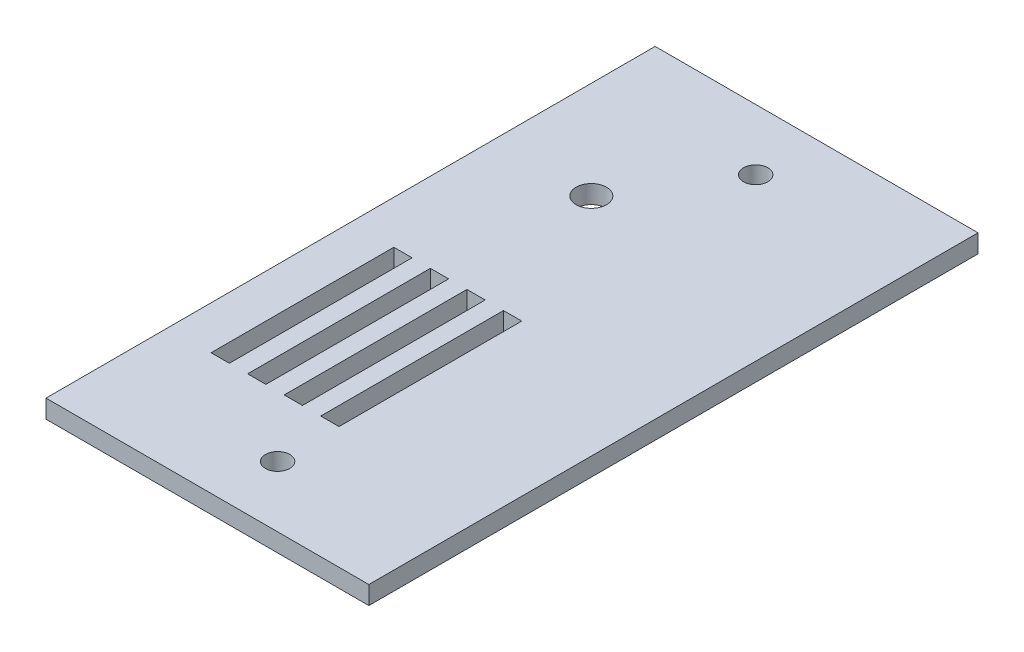
ISO-10303-21;
HEADER;
FILE_DESCRIPTION(('STEP AP214'),'2;1');
FILE_NAME('part.step','',(''),(''),'','','');
FILE_SCHEMA(('AUTOMOTIVE_DESIGN { 1 0 10303 214 1 1 1 1 }'));
ENDSEC;
DATA;
#1=APPLICATION_CONTEXT('core data for automotive mechanical design processes');
#2=APPLICATION_PROTOCOL_DEFINITION('international standard','automotive_design',2000,#1);
#3=PRODUCT_CONTEXT('',#1,'mechanical');
#4=PRODUCT('Part','Part','',(#3));
#5=PRODUCT_RELATED_PRODUCT_CATEGORY('part','',(#4));
#6=PRODUCT_DEFINITION_FORMATION('','',#4);
#7=PRODUCT_DEFINITION_CONTEXT('part definition',#1,'design');
#8=PRODUCT_DEFINITION('design','',#6,#7);
#9=PRODUCT_DEFINITION_SHAPE('','',#8);
#10=(LENGTH_UNIT() NAMED_UNIT(*) SI_UNIT(.MILLI.,.METRE.));
#11=(NAMED_UNIT(*) PLANE_ANGLE_UNIT() SI_UNIT($,.RADIAN.));
#12=(NAMED_UNIT(*) SI_UNIT($,.STERADIAN.) SOLID_ANGLE_UNIT());
#13=UNCERTAINTY_MEASURE_WITH_UNIT(LENGTH_MEASURE(1.E-05),#10,'distance_accuracy_value','');
#14=(GEOMETRIC_REPRESENTATION_CONTEXT(3) GLOBAL_UNCERTAINTY_ASSIGNED_CONTEXT((#13)) GLOBAL_UNIT_ASSIGNED_CONTEXT((#10,
#11,#12)) REPRESENTATION_CONTEXT('',''));
#15=CARTESIAN_POINT('',(0.,0.,0.));
#16=DIRECTION('',(0.,0.,1.));
#17=DIRECTION('',(1.,0.,0.));
#18=AXIS2_PLACEMENT_3D('',#15,#16,#17);
#19=CARTESIAN_POINT('',(-53.020406011683,3.,-100.000000000001));
#20=DIRECTION('',(1.,0.,0.));
#21=DIRECTION('',(0.,0.,-1.));
#22=AXIS2_PLACEMENT_3D('',#19,#20,#21);
#23=PLANE('',#22);
#24=DIRECTION('',(0.,0.,1.));
#25=VECTOR('',#24,1.);
#26=CARTESIAN_POINT('',(-53.020406011683,0.,-100.000000000001));
#27=LINE('',#26,#25);
#28=CARTESIAN_POINT('',(-53.020406011683,0.,-100.000000000001));
#29=VERTEX_POINT('',#28);
#30=CARTESIAN_POINT('',(-53.020406011683,0.,-8.88178419700125E-13));
#31=VERTEX_POINT('',#30);
#32=EDGE_CURVE('E330',#29,#31,#27,.T.);
#33=ORIENTED_EDGE('',*,*,#32,.T.);
#34=DIRECTION('',(0.,-1.,0.));
#35=VECTOR('',#34,1.);
#36=CARTESIAN_POINT('',(-53.020406011683,3.,-8.88178419700125E-13));
#37=LINE('',#36,#35);
#38=CARTESIAN_POINT('',(-53.020406011683,3.,-8.88178419700125E-13));
#39=VERTEX_POINT('',#38);
#40=EDGE_CURVE('E353',#39,#31,#37,.T.);
#41=ORIENTED_EDGE('',*,*,#40,.F.);
#42=DIRECTION('',(0.,0.,1.));
#43=VECTOR('',#42,1.);
#44=CARTESIAN_POINT('',(-53.020406011683,3.,-100.000000000001));
#45=LINE('',#44,#43);
#46=CARTESIAN_POINT('',(-53.020406011683,3.,-100.000000000001));
#47=VERTEX_POINT('',#46);
#48=EDGE_CURVE('E313',#47,#39,#45,.T.);
#49=ORIENTED_EDGE('',*,*,#48,.F.);
#50=DIRECTION('',(0.,-1.,0.));
#51=VECTOR('',#50,1.);
#52=CARTESIAN_POINT('',(-53.020406011683,3.,-100.000000000001));
#53=LINE('',#52,#51);
#54=EDGE_CURVE('E329',#47,#29,#53,.T.);
#55=ORIENTED_EDGE('',*,*,#54,.T.);
#56=EDGE_LOOP('',(#33,#41,#49,#55));
#57=FACE_BOUND('',#56,.T.);
#58=ADVANCED_FACE('F39',(#57),#23,.F.);
#59=CARTESIAN_POINT('',(-53.020406011683,3.,-8.88178419700125E-13));
#60=DIRECTION('',(0.,0.,-1.));
#61=DIRECTION('',(-1.,0.,0.));
#62=AXIS2_PLACEMENT_3D('',#59,#60,#61);
#63=PLANE('',#62);
#64=DIRECTION('',(1.,0.,0.));
#65=VECTOR('',#64,1.);
#66=CARTESIAN_POINT('',(-53.020406011683,0.,-8.88178419700125E-13));
#67=LINE('',#66,#65);
#68=CARTESIAN_POINT('',(-0.0204060116829677,0.,-8.88178419700125E-13));
#69=VERTEX_POINT('',#68);
#70=EDGE_CURVE('E334',#31,#69,#67,.T.);
#71=ORIENTED_EDGE('',*,*,#70,.T.);
#72=DIRECTION('',(0.,-1.,0.));
#73=VECTOR('',#72,1.);
#74=CARTESIAN_POINT('',(-0.0204060116829677,3.,-8.88178419700125E-13));
#75=LINE('',#74,#73);
#76=CARTESIAN_POINT('',(-0.0204060116829677,3.,-8.88178419700125E-13));
#77=VERTEX_POINT('',#76);
#78=EDGE_CURVE('E350',#77,#69,#75,.T.);
#79=ORIENTED_EDGE('',*,*,#78,.F.);
#80=DIRECTION('',(1.,0.,0.));
#81=VECTOR('',#80,1.);
#82=CARTESIAN_POINT('',(-53.020406011683,3.,-8.88178419700125E-13));
#83=LINE('',#82,#81);
#84=EDGE_CURVE('E317',#39,#77,#83,.T.);
#85=ORIENTED_EDGE('',*,*,#84,.F.);
#86=ORIENTED_EDGE('',*,*,#40,.T.);
#87=EDGE_LOOP('',(#71,#79,#85,#86));
#88=FACE_BOUND('',#87,.T.);
#89=ADVANCED_FACE('F441',(#88),#63,.F.);
#90=CARTESIAN_POINT('',(-0.0204060116829816,3.,-100.000000000001));
#91=DIRECTION('',(1.,0.,0.));
#92=DIRECTION('',(0.,0.,-1.));
#93=AXIS2_PLACEMENT_3D('',#90,#91,#92);
#94=PLANE('',#93);
#95=DIRECTION('',(0.,0.,1.));
#96=VECTOR('',#95,1.);
#97=CARTESIAN_POINT('',(-0.0204060116829816,0.,-100.000000000001));
#98=LINE('',#97,#96);
#99=CARTESIAN_POINT('',(-0.0204060116829816,0.,-100.000000000001));
#100=VERTEX_POINT('',#99);
#101=EDGE_CURVE('E338',#100,#69,#98,.T.);
#102=ORIENTED_EDGE('',*,*,#101,.F.);
#103=DIRECTION('',(0.,-1.,0.));
#104=VECTOR('',#103,1.);
#105=CARTESIAN_POINT('',(-0.0204060116829816,3.,-100.000000000001));
#106=LINE('',#105,#104);
#107=CARTESIAN_POINT('',(-0.0204060116829816,3.,-100.000000000001));
#108=VERTEX_POINT('',#107);
#109=EDGE_CURVE('E347',#108,#100,#106,.T.);
#110=ORIENTED_EDGE('',*,*,#109,.F.);
#111=DIRECTION('',(0.,0.,1.));
#112=VECTOR('',#111,1.);
#113=CARTESIAN_POINT('',(-0.0204060116829816,3.,-100.000000000001));
#114=LINE('',#113,#112);
#115=EDGE_CURVE('E321',#108,#77,#114,.T.);
#116=ORIENTED_EDGE('',*,*,#115,.T.);
#117=ORIENTED_EDGE('',*,*,#78,.T.);
#118=EDGE_LOOP('',(#102,#110,#116,#117));
#119=FACE_BOUND('',#118,.T.);
#120=ADVANCED_FACE('F446',(#119),#94,.T.);
#121=CARTESIAN_POINT('',(-53.020406011683,3.,-100.000000000001));
#122=DIRECTION('',(0.,0.,-1.));
#123=DIRECTION('',(-1.,0.,0.));
#124=AXIS2_PLACEMENT_3D('',#121,#122,#123);
#125=PLANE('',#124);
#126=DIRECTION('',(1.,0.,0.));
#127=VECTOR('',#126,1.);
#128=CARTESIAN_POINT('',(-53.020406011683,0.,-100.000000000001));
#129=LINE('',#128,#127);
#130=EDGE_CURVE('E318',#29,#100,#129,.T.);
#131=ORIENTED_EDGE('',*,*,#130,.F.);
#132=ORIENTED_EDGE('',*,*,#54,.F.);
#133=DIRECTION('',(1.,0.,0.));
#134=VECTOR('',#133,1.);
#135=CARTESIAN_POINT('',(-53.020406011683,3.,-100.000000000001));
#136=LINE('',#135,#134);
#137=EDGE_CURVE('E325',#47,#108,#136,.T.);
#138=ORIENTED_EDGE('',*,*,#137,.T.);
#139=ORIENTED_EDGE('',*,*,#109,.T.);
#140=EDGE_LOOP('',(#131,#132,#138,#139));
#141=FACE_BOUND('',#140,.T.);
#142=ADVANCED_FACE('F454',(#141),#125,.T.);
#143=CARTESIAN_POINT('',(0.,3.,0.));
#144=DIRECTION('',(0.,1.,0.));
#145=DIRECTION('',(0.,0.,1.));
#146=AXIS2_PLACEMENT_3D('',#143,#144,#145);
#147=PLANE('',#146);
#148=DIRECTION('',(0.,0.,1.));
#149=VECTOR('',#148,1.);
#150=CARTESIAN_POINT('',(-45.9194619358074,3.,-20.0000000000009));
#151=LINE('',#150,#149);
#152=CARTESIAN_POINT('',(-45.9194619358074,3.,-50.0000000000009));
#153=VERTEX_POINT('',#152);
#154=CARTESIAN_POINT('',(-45.9194619358074,3.,-20.0000000000009));
#155=VERTEX_POINT('',#154);
#156=EDGE_CURVE('E54',#153,#155,#151,.T.);
#157=ORIENTED_EDGE('',*,*,#156,.F.);
#158=DIRECTION('',(-1.,0.,0.));
#159=VECTOR('',#158,1.);
#160=CARTESIAN_POINT('',(-45.9194619358074,3.,-50.0000000000009));
#161=LINE('',#160,#159);
#162=CARTESIAN_POINT('',(-42.9194619358074,3.,-50.0000000000009));
#163=VERTEX_POINT('',#162);
#164=EDGE_CURVE('E202',#163,#153,#161,.T.);
#165=ORIENTED_EDGE('',*,*,#164,.F.);
#166=DIRECTION('',(0.,0.,-1.));
#167=VECTOR('',#166,1.);
#168=CARTESIAN_POINT('',(-42.9194619358074,3.,-20.0000000000009));
#169=LINE('',#168,#167);
#170=CARTESIAN_POINT('',(-42.9194619358074,3.,-20.0000000000009));
#171=VERTEX_POINT('',#170);
#172=EDGE_CURVE('E183',#171,#163,#169,.T.);
#173=ORIENTED_EDGE('',*,*,#172,.F.);
#174=DIRECTION('',(1.,0.,0.));
#175=VECTOR('',#174,1.);
#176=CARTESIAN_POINT('',(-45.9194619358074,3.,-20.0000000000009));
#177=LINE('',#176,#175);
#178=EDGE_CURVE('E194',#155,#171,#177,.T.);
#179=ORIENTED_EDGE('',*,*,#178,.F.);
#180=EDGE_LOOP('',(#157,#165,#173,#179));
#181=FACE_BOUND('',#180,.T.);
#182=DIRECTION('',(0.,0.,-1.));
#183=VECTOR('',#182,1.);
#184=CARTESIAN_POINT('',(-36.9194619358074,3.,-20.0000000000009));
#185=LINE('',#184,#183);
#186=CARTESIAN_POINT('',(-36.9194619358074,3.,-20.0000000000009));
#187=VERTEX_POINT('',#186);
#188=CARTESIAN_POINT('',(-36.9194619358074,3.,-50.0000000000009));
#189=VERTEX_POINT('',#188);
#190=EDGE_CURVE('E62',#187,#189,#185,.T.);
#191=ORIENTED_EDGE('',*,*,#190,.F.);
#192=DIRECTION('',(1.,0.,0.));
#193=VECTOR('',#192,1.);
#194=CARTESIAN_POINT('',(-39.9194619358074,3.,-20.0000000000009));
#195=LINE('',#194,#193);
#196=CARTESIAN_POINT('',(-39.9194619358074,3.,-20.0000000000009));
#197=VERTEX_POINT('',#196);
#198=EDGE_CURVE('E228',#197,#187,#195,.T.);
#199=ORIENTED_EDGE('',*,*,#198,.F.);
#200=DIRECTION('',(0.,0.,1.));
#201=VECTOR('',#200,1.);
#202=CARTESIAN_POINT('',(-39.9194619358074,3.,-20.0000000000009));
#203=LINE('',#202,#201);
#204=CARTESIAN_POINT('',(-39.9194619358074,3.,-50.0000000000009));
#205=VERTEX_POINT('',#204);
#206=EDGE_CURVE('E224',#205,#197,#203,.T.);
#207=ORIENTED_EDGE('',*,*,#206,.F.);
#208=DIRECTION('',(-1.,0.,0.));
#209=VECTOR('',#208,1.);
#210=CARTESIAN_POINT('',(-39.9194619358074,3.,-50.0000000000009));
#211=LINE('',#210,#209);
#212=EDGE_CURVE('E219',#189,#205,#211,.T.);
#213=ORIENTED_EDGE('',*,*,#212,.F.);
#214=EDGE_LOOP('',(#191,#199,#207,#213));
#215=FACE_BOUND('',#214,.T.);
#216=DIRECTION('',(0.,0.,-1.));
#217=VECTOR('',#216,1.);
#218=CARTESIAN_POINT('',(-30.9194619358074,3.,-50.0000000000009));
#219=LINE('',#218,#217);
#220=CARTESIAN_POINT('',(-30.9194619358074,3.,-20.0000000000009));
#221=VERTEX_POINT('',#220);
#222=CARTESIAN_POINT('',(-30.9194619358074,3.,-50.0000000000009));
#223=VERTEX_POINT('',#222);
#224=EDGE_CURVE('E244',#221,#223,#219,.T.);
#225=ORIENTED_EDGE('',*,*,#224,.F.);
#226=DIRECTION('',(1.,0.,0.));
#227=VECTOR('',#226,1.);
#228=CARTESIAN_POINT('',(-33.9194619358074,3.,-20.0000000000009));
#229=LINE('',#228,#227);
#230=CARTESIAN_POINT('',(-33.9194619358074,3.,-20.0000000000009));
#231=VERTEX_POINT('',#230);
#232=EDGE_CURVE('E256',#231,#221,#229,.T.);
#233=ORIENTED_EDGE('',*,*,#232,.F.);
#234=DIRECTION('',(0.,0.,1.));
#235=VECTOR('',#234,1.);
#236=CARTESIAN_POINT('',(-33.9194619358074,3.,-50.0000000000009));
#237=LINE('',#236,#235);
#238=CARTESIAN_POINT('',(-33.9194619358074,3.,-50.0000000000009));
#239=VERTEX_POINT('',#238);
#240=EDGE_CURVE('E252',#239,#231,#237,.T.);
#241=ORIENTED_EDGE('',*,*,#240,.F.);
#242=DIRECTION('',(-1.,0.,0.));
#243=VECTOR('',#242,1.);
#244=CARTESIAN_POINT('',(-33.9194619358074,3.,-50.0000000000009));
#245=LINE('',#244,#243);
#246=EDGE_CURVE('E247',#223,#239,#245,.T.);
#247=ORIENTED_EDGE('',*,*,#246,.F.);
#248=EDGE_LOOP('',(#225,#233,#241,#247));
#249=FACE_BOUND('',#248,.T.);
#250=DIRECTION('',(0.,0.,-1.));
#251=VECTOR('',#250,1.);
#252=CARTESIAN_POINT('',(-24.9194619358074,3.,-20.0000000000009));
#253=LINE('',#252,#251);
#254=CARTESIAN_POINT('',(-24.9194619358074,3.,-20.0000000000009));
#255=VERTEX_POINT('',#254);
#256=CARTESIAN_POINT('',(-24.9194619358074,3.,-50.0000000000009));
#257=VERTEX_POINT('',#256);
#258=EDGE_CURVE('E272',#255,#257,#253,.T.);
#259=ORIENTED_EDGE('',*,*,#258,.F.);
#260=DIRECTION('',(1.,0.,0.));
#261=VECTOR('',#260,1.);
#262=CARTESIAN_POINT('',(-27.9194619358074,3.,-20.0000000000009));
#263=LINE('',#262,#261);
#264=CARTESIAN_POINT('',(-27.9194619358074,3.,-20.0000000000009));
#265=VERTEX_POINT('',#264);
#266=EDGE_CURVE('E283',#265,#255,#263,.T.);
#267=ORIENTED_EDGE('',*,*,#266,.F.);
#268=DIRECTION('',(0.,0.,1.));
#269=VECTOR('',#268,1.);
#270=CARTESIAN_POINT('',(-27.9194619358074,3.,-20.0000000000009));
#271=LINE('',#270,#269);
#272=CARTESIAN_POINT('',(-27.9194619358074,3.,-50.0000000000009));
#273=VERTEX_POINT('',#272);
#274=EDGE_CURVE('E279',#273,#265,#271,.T.);
#275=ORIENTED_EDGE('',*,*,#274,.F.);
#276=DIRECTION('',(-1.,0.,0.));
#277=VECTOR('',#276,1.);
#278=CARTESIAN_POINT('',(-27.9194619358074,3.,-50.0000000000009));
#279=LINE('',#278,#277);
#280=EDGE_CURVE('E275',#257,#273,#279,.T.);
#281=ORIENTED_EDGE('',*,*,#280,.F.);
#282=EDGE_LOOP('',(#259,#267,#275,#281));
#283=FACE_BOUND('',#282,.T.);
#284=CARTESIAN_POINT('',(-26.520406011683,3.,-90.0000000000009));
#285=DIRECTION('',(0.,1.,0.));
#286=DIRECTION('',(0.,0.,1.));
#287=AXIS2_PLACEMENT_3D('',#284,#285,#286);
#288=CIRCLE('',#287,2.);
#289=CARTESIAN_POINT('',(-26.520406011683,3.,-88.0000000000009));
#290=VERTEX_POINT('',#289);
#291=EDGE_CURVE('E212',#290,#290,#288,.T.);
#292=ORIENTED_EDGE('',*,*,#291,.F.);
#293=EDGE_LOOP('',(#292));
#294=FACE_BOUND('',#293,.T.);
#295=CARTESIAN_POINT('',(-37.,3.,-73.5));
#296=DIRECTION('',(0.,1.,0.));
#297=DIRECTION('',(0.,0.,1.));
#298=AXIS2_PLACEMENT_3D('',#295,#296,#297);
#299=CIRCLE('',#298,2.5);
#300=CARTESIAN_POINT('',(-37.,3.,-71.));
#301=VERTEX_POINT('',#300);
#302=EDGE_CURVE('E303',#301,#301,#299,.T.);
#303=ORIENTED_EDGE('',*,*,#302,.F.);
#304=EDGE_LOOP('',(#303));
#305=FACE_BOUND('',#304,.T.);
#306=CARTESIAN_POINT('',(-25.,3.,-10.));
#307=DIRECTION('',(0.,1.,0.));
#308=DIRECTION('',(0.,0.,1.));
#309=AXIS2_PLACEMENT_3D('',#306,#307,#308);
#310=CIRCLE('',#309,2.);
#311=CARTESIAN_POINT('',(-25.,3.,-8.));
#312=VERTEX_POINT('',#311);
#313=EDGE_CURVE('E308',#312,#312,#310,.T.);
#314=ORIENTED_EDGE('',*,*,#313,.F.);
#315=EDGE_LOOP('',(#314));
#316=FACE_BOUND('',#315,.T.);
#317=ORIENTED_EDGE('',*,*,#48,.T.);
#318=ORIENTED_EDGE('',*,*,#84,.T.);
#319=ORIENTED_EDGE('',*,*,#115,.F.);
#320=ORIENTED_EDGE('',*,*,#137,.F.);
#321=EDGE_LOOP('',(#317,#318,#319,#320));
#322=FACE_BOUND('',#321,.T.);
#323=ADVANCED_FACE('F199',(#181,#215,#249,#283,#294,#305,#316,#322),#147,.T.);
#324=CARTESIAN_POINT('',(0.,0.,0.));
#325=DIRECTION('',(0.,1.,0.));
#326=DIRECTION('',(0.,0.,1.));
#327=AXIS2_PLACEMENT_3D('',#324,#325,#326);
#328=PLANE('',#327);
#329=DIRECTION('',(-1.,0.,0.));
#330=VECTOR('',#329,1.);
#331=CARTESIAN_POINT('',(0.,0.,-50.0000000000009));
#332=LINE('',#331,#330);
#333=CARTESIAN_POINT('',(-42.9194619358074,0.,-50.0000000000009));
#334=VERTEX_POINT('',#333);
#335=CARTESIAN_POINT('',(-45.9194619358074,0.,-50.0000000000009));
#336=VERTEX_POINT('',#335);
#337=EDGE_CURVE('E47',#334,#336,#332,.T.);
#338=ORIENTED_EDGE('',*,*,#337,.T.);
#339=DIRECTION('',(0.,0.,1.));
#340=VECTOR('',#339,1.);
#341=CARTESIAN_POINT('',(-45.9194619358074,0.,0.));
#342=LINE('',#341,#340);
#343=CARTESIAN_POINT('',(-45.9194619358074,0.,-20.0000000000009));
#344=VERTEX_POINT('',#343);
#345=EDGE_CURVE('E11',#336,#344,#342,.T.);
#346=ORIENTED_EDGE('',*,*,#345,.T.);
#347=DIRECTION('',(1.,0.,0.));
#348=VECTOR('',#347,1.);
#349=CARTESIAN_POINT('',(0.,0.,-20.0000000000009));
#350=LINE('',#349,#348);
#351=CARTESIAN_POINT('',(-42.9194619358074,0.,-20.0000000000009));
#352=VERTEX_POINT('',#351);
#353=EDGE_CURVE('E414',#344,#352,#350,.T.);
#354=ORIENTED_EDGE('',*,*,#353,.T.);
#355=DIRECTION('',(0.,0.,-1.));
#356=VECTOR('',#355,1.);
#357=CARTESIAN_POINT('',(-42.9194619358074,0.,0.));
#358=LINE('',#357,#356);
#359=EDGE_CURVE('E186',#352,#334,#358,.T.);
#360=ORIENTED_EDGE('',*,*,#359,.T.);
#361=EDGE_LOOP('',(#338,#346,#354,#360));
#362=FACE_BOUND('',#361,.T.);
#363=DIRECTION('',(1.,0.,0.));
#364=VECTOR('',#363,1.);
#365=CARTESIAN_POINT('',(0.,0.,-20.0000000000009));
#366=LINE('',#365,#364);
#367=CARTESIAN_POINT('',(-39.9194619358074,0.,-20.0000000000009));
#368=VERTEX_POINT('',#367);
#369=CARTESIAN_POINT('',(-36.9194619358074,0.,-20.0000000000009));
#370=VERTEX_POINT('',#369);
#371=EDGE_CURVE('E406',#368,#370,#366,.T.);
#372=ORIENTED_EDGE('',*,*,#371,.T.);
#373=DIRECTION('',(0.,0.,-1.));
#374=VECTOR('',#373,1.);
#375=CARTESIAN_POINT('',(-36.9194619358074,0.,0.));
#376=LINE('',#375,#374);
#377=CARTESIAN_POINT('',(-36.9194619358074,0.,-50.0000000000009));
#378=VERTEX_POINT('',#377);
#379=EDGE_CURVE('E410',#370,#378,#376,.T.);
#380=ORIENTED_EDGE('',*,*,#379,.T.);
#381=DIRECTION('',(-1.,0.,0.));
#382=VECTOR('',#381,1.);
#383=CARTESIAN_POINT('',(0.,0.,-50.0000000000009));
#384=LINE('',#383,#382);
#385=CARTESIAN_POINT('',(-39.9194619358074,0.,-50.0000000000009));
#386=VERTEX_POINT('',#385);
#387=EDGE_CURVE('E398',#378,#386,#384,.T.);
#388=ORIENTED_EDGE('',*,*,#387,.T.);
#389=DIRECTION('',(0.,0.,1.));
#390=VECTOR('',#389,1.);
#391=CARTESIAN_POINT('',(-39.9194619358074,0.,0.));
#392=LINE('',#391,#390);
#393=EDGE_CURVE('E402',#386,#368,#392,.T.);
#394=ORIENTED_EDGE('',*,*,#393,.T.);
#395=EDGE_LOOP('',(#372,#380,#388,#394));
#396=FACE_BOUND('',#395,.T.);
#397=DIRECTION('',(1.,0.,0.));
#398=VECTOR('',#397,1.);
#399=CARTESIAN_POINT('',(0.,0.,-20.0000000000009));
#400=LINE('',#399,#398);
#401=CARTESIAN_POINT('',(-33.9194619358074,0.,-20.0000000000009));
#402=VERTEX_POINT('',#401);
#403=CARTESIAN_POINT('',(-30.9194619358074,0.,-20.0000000000009));
#404=VERTEX_POINT('',#403);
#405=EDGE_CURVE('E390',#402,#404,#400,.T.);
#406=ORIENTED_EDGE('',*,*,#405,.T.);
#407=DIRECTION('',(0.,0.,-1.));
#408=VECTOR('',#407,1.);
#409=CARTESIAN_POINT('',(-30.9194619358074,0.,0.));
#410=LINE('',#409,#408);
#411=CARTESIAN_POINT('',(-30.9194619358074,0.,-50.0000000000009));
#412=VERTEX_POINT('',#411);
#413=EDGE_CURVE('E394',#404,#412,#410,.T.);
#414=ORIENTED_EDGE('',*,*,#413,.T.);
#415=DIRECTION('',(-1.,0.,0.));
#416=VECTOR('',#415,1.);
#417=CARTESIAN_POINT('',(0.,0.,-50.0000000000009));
#418=LINE('',#417,#416);
#419=CARTESIAN_POINT('',(-33.9194619358074,0.,-50.0000000000009));
#420=VERTEX_POINT('',#419);
#421=EDGE_CURVE('E382',#412,#420,#418,.T.);
#422=ORIENTED_EDGE('',*,*,#421,.T.);
#423=DIRECTION('',(0.,0.,1.));
#424=VECTOR('',#423,1.);
#425=CARTESIAN_POINT('',(-33.9194619358074,0.,0.));
#426=LINE('',#425,#424);
#427=EDGE_CURVE('E386',#420,#402,#426,.T.);
#428=ORIENTED_EDGE('',*,*,#427,.T.);
#429=EDGE_LOOP('',(#406,#414,#422,#428));
#430=FACE_BOUND('',#429,.T.);
#431=DIRECTION('',(1.,0.,0.));
#432=VECTOR('',#431,1.);
#433=CARTESIAN_POINT('',(0.,0.,-20.0000000000009));
#434=LINE('',#433,#432);
#435=CARTESIAN_POINT('',(-27.9194619358074,0.,-20.0000000000009));
#436=VERTEX_POINT('',#435);
#437=CARTESIAN_POINT('',(-24.9194619358074,0.,-20.0000000000009));
#438=VERTEX_POINT('',#437);
#439=EDGE_CURVE('E374',#436,#438,#434,.T.);
#440=ORIENTED_EDGE('',*,*,#439,.T.);
#441=DIRECTION('',(0.,0.,-1.));
#442=VECTOR('',#441,1.);
#443=CARTESIAN_POINT('',(-24.9194619358074,0.,0.));
#444=LINE('',#443,#442);
#445=CARTESIAN_POINT('',(-24.9194619358074,0.,-50.0000000000009));
#446=VERTEX_POINT('',#445);
#447=EDGE_CURVE('E378',#438,#446,#444,.T.);
#448=ORIENTED_EDGE('',*,*,#447,.T.);
#449=DIRECTION('',(-1.,0.,0.));
#450=VECTOR('',#449,1.);
#451=CARTESIAN_POINT('',(0.,0.,-50.0000000000009));
#452=LINE('',#451,#450);
#453=CARTESIAN_POINT('',(-27.9194619358074,0.,-50.0000000000009));
#454=VERTEX_POINT('',#453);
#455=EDGE_CURVE('E357',#446,#454,#452,.T.);
#456=ORIENTED_EDGE('',*,*,#455,.T.);
#457=DIRECTION('',(0.,0.,1.));
#458=VECTOR('',#457,1.);
#459=CARTESIAN_POINT('',(-27.9194619358074,0.,0.));
#460=LINE('',#459,#458);
#461=EDGE_CURVE('E370',#454,#436,#460,.T.);
#462=ORIENTED_EDGE('',*,*,#461,.T.);
#463=EDGE_LOOP('',(#440,#448,#456,#462));
#464=FACE_BOUND('',#463,.T.);
#465=CARTESIAN_POINT('',(-26.520406011683,0.,-90.0000000000009));
#466=DIRECTION('',(0.,1.,0.));
#467=DIRECTION('',(0.,0.,1.));
#468=AXIS2_PLACEMENT_3D('',#465,#466,#467);
#469=CIRCLE('',#468,2.);
#470=CARTESIAN_POINT('',(-26.520406011683,0.,-88.0000000000009));
#471=VERTEX_POINT('',#470);
#472=EDGE_CURVE('E302',#471,#471,#469,.T.);
#473=ORIENTED_EDGE('',*,*,#472,.T.);
#474=EDGE_LOOP('',(#473));
#475=FACE_BOUND('',#474,.T.);
#476=CARTESIAN_POINT('',(-37.,0.,-73.5));
#477=DIRECTION('',(0.,1.,0.));
#478=DIRECTION('',(0.,0.,1.));
#479=AXIS2_PLACEMENT_3D('',#476,#477,#478);
#480=CIRCLE('',#479,2.5);
#481=CARTESIAN_POINT('',(-37.,0.,-71.));
#482=VERTEX_POINT('',#481);
#483=EDGE_CURVE('E307',#482,#482,#480,.T.);
#484=ORIENTED_EDGE('',*,*,#483,.T.);
#485=EDGE_LOOP('',(#484));
#486=FACE_BOUND('',#485,.T.);
#487=CARTESIAN_POINT('',(-25.,0.,-10.));
#488=DIRECTION('',(0.,1.,0.));
#489=DIRECTION('',(0.,0.,1.));
#490=AXIS2_PLACEMENT_3D('',#487,#488,#489);
#491=CIRCLE('',#490,2.);
#492=CARTESIAN_POINT('',(-25.,0.,-8.));
#493=VERTEX_POINT('',#492);
#494=EDGE_CURVE('E312',#493,#493,#491,.T.);
#495=ORIENTED_EDGE('',*,*,#494,.T.);
#496=EDGE_LOOP('',(#495));
#497=FACE_BOUND('',#496,.T.);
#498=ORIENTED_EDGE('',*,*,#32,.F.);
#499=ORIENTED_EDGE('',*,*,#130,.T.);
#500=ORIENTED_EDGE('',*,*,#101,.T.);
#501=ORIENTED_EDGE('',*,*,#70,.F.);
#502=EDGE_LOOP('',(#498,#499,#500,#501));
#503=FACE_BOUND('',#502,.T.);
#504=ADVANCED_FACE('F421',(#362,#396,#430,#464,#475,#486,#497,#503),#328,.F.);
#505=CARTESIAN_POINT('',(-25.,-7.,-10.));
#506=DIRECTION('',(0.,1.,0.));
#507=DIRECTION('',(0.,0.,1.));
#508=AXIS2_PLACEMENT_3D('',#505,#506,#507);
#509=CYLINDRICAL_SURFACE('',#508,2.);
#510=ORIENTED_EDGE('',*,*,#313,.T.);
#511=EDGE_LOOP('',(#510));
#512=FACE_BOUND('',#511,.T.);
#513=ORIENTED_EDGE('',*,*,#494,.F.);
#514=EDGE_LOOP('',(#513));
#515=FACE_BOUND('',#514,.T.);
#516=ADVANCED_FACE('F467',(#512,#515),#509,.F.);
#517=CARTESIAN_POINT('',(-37.,-7.,-73.5));
#518=DIRECTION('',(0.,1.,0.));
#519=DIRECTION('',(0.,0.,1.));
#520=AXIS2_PLACEMENT_3D('',#517,#518,#519);
#521=CYLINDRICAL_SURFACE('',#520,2.5);
#522=ORIENTED_EDGE('',*,*,#302,.T.);
#523=EDGE_LOOP('',(#522));
#524=FACE_BOUND('',#523,.T.);
#525=ORIENTED_EDGE('',*,*,#483,.F.);
#526=EDGE_LOOP('',(#525));
#527=FACE_BOUND('',#526,.T.);
#528=ADVANCED_FACE('F492',(#524,#527),#521,.F.);
#529=CARTESIAN_POINT('',(-26.520406011683,-7.,-90.0000000000009));
#530=DIRECTION('',(0.,1.,0.));
#531=DIRECTION('',(0.,0.,1.));
#532=AXIS2_PLACEMENT_3D('',#529,#530,#531);
#533=CYLINDRICAL_SURFACE('',#532,2.);
#534=ORIENTED_EDGE('',*,*,#291,.T.);
#535=EDGE_LOOP('',(#534));
#536=FACE_BOUND('',#535,.T.);
#537=ORIENTED_EDGE('',*,*,#472,.F.);
#538=EDGE_LOOP('',(#537));
#539=FACE_BOUND('',#538,.T.);
#540=ADVANCED_FACE('F502',(#536,#539),#533,.F.);
#541=CARTESIAN_POINT('',(-24.9194619358074,-7.,-20.0000000000009));
#542=DIRECTION('',(1.,0.,0.));
#543=DIRECTION('',(0.,0.,-1.));
#544=AXIS2_PLACEMENT_3D('',#541,#542,#543);
#545=PLANE('',#544);
#546=DIRECTION('',(0.,1.,0.));
#547=VECTOR('',#546,1.);
#548=CARTESIAN_POINT('',(-24.9194619358074,-7.,-20.0000000000009));
#549=LINE('',#548,#547);
#550=EDGE_CURVE('E248',#438,#255,#549,.T.);
#551=ORIENTED_EDGE('',*,*,#550,.T.);
#552=ORIENTED_EDGE('',*,*,#258,.T.);
#553=DIRECTION('',(0.,1.,0.));
#554=VECTOR('',#553,1.);
#555=CARTESIAN_POINT('',(-24.9194619358074,-7.,-50.0000000000009));
#556=LINE('',#555,#554);
#557=EDGE_CURVE('E287',#446,#257,#556,.T.);
#558=ORIENTED_EDGE('',*,*,#557,.F.);
#559=ORIENTED_EDGE('',*,*,#447,.F.);
#560=EDGE_LOOP('',(#551,#552,#558,#559));
#561=FACE_BOUND('',#560,.T.);
#562=ADVANCED_FACE('F510',(#561),#545,.F.);
#563=CARTESIAN_POINT('',(-27.9194619358074,-7.,-20.0000000000009));
#564=DIRECTION('',(0.,0.,1.));
#565=DIRECTION('',(1.,0.,0.));
#566=AXIS2_PLACEMENT_3D('',#563,#564,#565);
#567=PLANE('',#566);
#568=DIRECTION('',(0.,1.,0.));
#569=VECTOR('',#568,1.);
#570=CARTESIAN_POINT('',(-27.9194619358074,-7.,-20.0000000000009));
#571=LINE('',#570,#569);
#572=EDGE_CURVE('E290',#436,#265,#571,.T.);
#573=ORIENTED_EDGE('',*,*,#572,.T.);
#574=ORIENTED_EDGE('',*,*,#266,.T.);
#575=ORIENTED_EDGE('',*,*,#550,.F.);
#576=ORIENTED_EDGE('',*,*,#439,.F.);
#577=EDGE_LOOP('',(#573,#574,#575,#576));
#578=FACE_BOUND('',#577,.T.);
#579=ADVANCED_FACE('F529',(#578),#567,.F.);
#580=CARTESIAN_POINT('',(-27.9194619358074,-7.,-20.0000000000009));
#581=DIRECTION('',(-1.,0.,0.));
#582=DIRECTION('',(0.,0.,1.));
#583=AXIS2_PLACEMENT_3D('',#580,#581,#582);
#584=PLANE('',#583);
#585=DIRECTION('',(0.,1.,0.));
#586=VECTOR('',#585,1.);
#587=CARTESIAN_POINT('',(-27.9194619358074,-7.,-50.0000000000009));
#588=LINE('',#587,#586);
#589=EDGE_CURVE('E293',#454,#273,#588,.T.);
#590=ORIENTED_EDGE('',*,*,#589,.T.);
#591=ORIENTED_EDGE('',*,*,#274,.T.);
#592=ORIENTED_EDGE('',*,*,#572,.F.);
#593=ORIENTED_EDGE('',*,*,#461,.F.);
#594=EDGE_LOOP('',(#590,#591,#592,#593));
#595=FACE_BOUND('',#594,.T.);
#596=ADVANCED_FACE('F539',(#595),#584,.F.);
#597=CARTESIAN_POINT('',(-27.9194619358074,-7.,-50.0000000000009));
#598=DIRECTION('',(0.,0.,-1.));
#599=DIRECTION('',(-1.,0.,0.));
#600=AXIS2_PLACEMENT_3D('',#597,#598,#599);
#601=PLANE('',#600);
#602=ORIENTED_EDGE('',*,*,#557,.T.);
#603=ORIENTED_EDGE('',*,*,#280,.T.);
#604=ORIENTED_EDGE('',*,*,#589,.F.);
#605=ORIENTED_EDGE('',*,*,#455,.F.);
#606=EDGE_LOOP('',(#602,#603,#604,#605));
#607=FACE_BOUND('',#606,.T.);
#608=ADVANCED_FACE('F549',(#607),#601,.F.);
#609=CARTESIAN_POINT('',(-30.9194619358074,-7.,-50.0000000000009));
#610=DIRECTION('',(1.,0.,0.));
#611=DIRECTION('',(0.,0.,-1.));
#612=AXIS2_PLACEMENT_3D('',#609,#610,#611);
#613=PLANE('',#612);
#614=DIRECTION('',(0.,1.,0.));
#615=VECTOR('',#614,1.);
#616=CARTESIAN_POINT('',(-30.9194619358074,-7.,-20.0000000000009));
#617=LINE('',#616,#615);
#618=EDGE_CURVE('E220',#404,#221,#617,.T.);
#619=ORIENTED_EDGE('',*,*,#618,.T.);
#620=ORIENTED_EDGE('',*,*,#224,.T.);
#621=DIRECTION('',(0.,1.,0.));
#622=VECTOR('',#621,1.);
#623=CARTESIAN_POINT('',(-30.9194619358074,-7.,-50.0000000000009));
#624=LINE('',#623,#622);
#625=EDGE_CURVE('E260',#412,#223,#624,.T.);
#626=ORIENTED_EDGE('',*,*,#625,.F.);
#627=ORIENTED_EDGE('',*,*,#413,.F.);
#628=EDGE_LOOP('',(#619,#620,#626,#627));
#629=FACE_BOUND('',#628,.T.);
#630=ADVANCED_FACE('F559',(#629),#613,.F.);
#631=CARTESIAN_POINT('',(-33.9194619358074,-7.,-20.0000000000009));
#632=DIRECTION('',(0.,0.,1.));
#633=DIRECTION('',(1.,0.,0.));
#634=AXIS2_PLACEMENT_3D('',#631,#632,#633);
#635=PLANE('',#634);
#636=DIRECTION('',(0.,1.,0.));
#637=VECTOR('',#636,1.);
#638=CARTESIAN_POINT('',(-33.9194619358074,-7.,-20.0000000000009));
#639=LINE('',#638,#637);
#640=EDGE_CURVE('E263',#402,#231,#639,.T.);
#641=ORIENTED_EDGE('',*,*,#640,.T.);
#642=ORIENTED_EDGE('',*,*,#232,.T.);
#643=ORIENTED_EDGE('',*,*,#618,.F.);
#644=ORIENTED_EDGE('',*,*,#405,.F.);
#645=EDGE_LOOP('',(#641,#642,#643,#644));
#646=FACE_BOUND('',#645,.T.);
#647=ADVANCED_FACE('F569',(#646),#635,.F.);
#648=CARTESIAN_POINT('',(-33.9194619358074,-7.,-50.0000000000009));
#649=DIRECTION('',(-1.,0.,0.));
#650=DIRECTION('',(0.,0.,1.));
#651=AXIS2_PLACEMENT_3D('',#648,#649,#650);
#652=PLANE('',#651);
#653=DIRECTION('',(0.,1.,0.));
#654=VECTOR('',#653,1.);
#655=CARTESIAN_POINT('',(-33.9194619358074,-7.,-50.0000000000009));
#656=LINE('',#655,#654);
#657=EDGE_CURVE('E266',#420,#239,#656,.T.);
#658=ORIENTED_EDGE('',*,*,#657,.T.);
#659=ORIENTED_EDGE('',*,*,#240,.T.);
#660=ORIENTED_EDGE('',*,*,#640,.F.);
#661=ORIENTED_EDGE('',*,*,#427,.F.);
#662=EDGE_LOOP('',(#658,#659,#660,#661));
#663=FACE_BOUND('',#662,.T.);
#664=ADVANCED_FACE('F579',(#663),#652,.F.);
#665=CARTESIAN_POINT('',(-33.9194619358074,-7.,-50.0000000000009));
#666=DIRECTION('',(0.,0.,-1.));
#667=DIRECTION('',(-1.,0.,0.));
#668=AXIS2_PLACEMENT_3D('',#665,#666,#667);
#669=PLANE('',#668);
#670=ORIENTED_EDGE('',*,*,#625,.T.);
#671=ORIENTED_EDGE('',*,*,#246,.T.);
#672=ORIENTED_EDGE('',*,*,#657,.F.);
#673=ORIENTED_EDGE('',*,*,#421,.F.);
#674=EDGE_LOOP('',(#670,#671,#672,#673));
#675=FACE_BOUND('',#674,.T.);
#676=ADVANCED_FACE('F589',(#675),#669,.F.);
#677=CARTESIAN_POINT('',(-36.9194619358074,-7.,-20.0000000000009));
#678=DIRECTION('',(1.,0.,0.));
#679=DIRECTION('',(0.,0.,-1.));
#680=AXIS2_PLACEMENT_3D('',#677,#678,#679);
#681=PLANE('',#680);
#682=DIRECTION('',(0.,1.,0.));
#683=VECTOR('',#682,1.);
#684=CARTESIAN_POINT('',(-36.9194619358074,-7.,-20.0000000000009));
#685=LINE('',#684,#683);
#686=EDGE_CURVE('E233',#370,#187,#685,.T.);
#687=ORIENTED_EDGE('',*,*,#686,.T.);
#688=ORIENTED_EDGE('',*,*,#190,.T.);
#689=DIRECTION('',(0.,1.,0.));
#690=VECTOR('',#689,1.);
#691=CARTESIAN_POINT('',(-36.9194619358074,-7.,-50.0000000000009));
#692=LINE('',#691,#690);
#693=EDGE_CURVE('E232',#378,#189,#692,.T.);
#694=ORIENTED_EDGE('',*,*,#693,.F.);
#695=ORIENTED_EDGE('',*,*,#379,.F.);
#696=EDGE_LOOP('',(#687,#688,#694,#695));
#697=FACE_BOUND('',#696,.T.);
#698=ADVANCED_FACE('F599',(#697),#681,.F.);
#699=CARTESIAN_POINT('',(-39.9194619358074,-7.,-20.0000000000009));
#700=DIRECTION('',(0.,0.,1.));
#701=DIRECTION('',(1.,0.,0.));
#702=AXIS2_PLACEMENT_3D('',#699,#700,#701);
#703=PLANE('',#702);
#704=DIRECTION('',(0.,1.,0.));
#705=VECTOR('',#704,1.);
#706=CARTESIAN_POINT('',(-39.9194619358074,-7.,-20.0000000000009));
#707=LINE('',#706,#705);
#708=EDGE_CURVE('E236',#368,#197,#707,.T.);
#709=ORIENTED_EDGE('',*,*,#708,.T.);
#710=ORIENTED_EDGE('',*,*,#198,.T.);
#711=ORIENTED_EDGE('',*,*,#686,.F.);
#712=ORIENTED_EDGE('',*,*,#371,.F.);
#713=EDGE_LOOP('',(#709,#710,#711,#712));
#714=FACE_BOUND('',#713,.T.);
#715=ADVANCED_FACE('F609',(#714),#703,.F.);
#716=CARTESIAN_POINT('',(-39.9194619358074,-7.,-20.0000000000009));
#717=DIRECTION('',(-1.,0.,0.));
#718=DIRECTION('',(0.,0.,1.));
#719=AXIS2_PLACEMENT_3D('',#716,#717,#718);
#720=PLANE('',#719);
#721=DIRECTION('',(0.,1.,0.));
#722=VECTOR('',#721,1.);
#723=CARTESIAN_POINT('',(-39.9194619358074,-7.,-50.0000000000009));
#724=LINE('',#723,#722);
#725=EDGE_CURVE('E239',#386,#205,#724,.T.);
#726=ORIENTED_EDGE('',*,*,#725,.T.);
#727=ORIENTED_EDGE('',*,*,#206,.T.);
#728=ORIENTED_EDGE('',*,*,#708,.F.);
#729=ORIENTED_EDGE('',*,*,#393,.F.);
#730=EDGE_LOOP('',(#726,#727,#728,#729));
#731=FACE_BOUND('',#730,.T.);
#732=ADVANCED_FACE('F435',(#731),#720,.F.);
#733=CARTESIAN_POINT('',(-39.9194619358074,-7.,-50.0000000000009));
#734=DIRECTION('',(0.,0.,-1.));
#735=DIRECTION('',(-1.,0.,0.));
#736=AXIS2_PLACEMENT_3D('',#733,#734,#735);
#737=PLANE('',#736);
#738=ORIENTED_EDGE('',*,*,#693,.T.);
#739=ORIENTED_EDGE('',*,*,#212,.T.);
#740=ORIENTED_EDGE('',*,*,#725,.F.);
#741=ORIENTED_EDGE('',*,*,#387,.F.);
#742=EDGE_LOOP('',(#738,#739,#740,#741));
#743=FACE_BOUND('',#742,.T.);
#744=ADVANCED_FACE('F428',(#743),#737,.F.);
#745=CARTESIAN_POINT('',(-45.9194619358074,-7.,-20.0000000000009));
#746=DIRECTION('',(-1.,0.,0.));
#747=DIRECTION('',(0.,0.,1.));
#748=AXIS2_PLACEMENT_3D('',#745,#746,#747);
#749=PLANE('',#748);
#750=DIRECTION('',(0.,1.,0.));
#751=VECTOR('',#750,1.);
#752=CARTESIAN_POINT('',(-45.9194619358074,-7.,-50.0000000000009));
#753=LINE('',#752,#751);
#754=EDGE_CURVE('E209',#336,#153,#753,.T.);
#755=ORIENTED_EDGE('',*,*,#754,.T.);
#756=ORIENTED_EDGE('',*,*,#156,.T.);
#757=DIRECTION('',(0.,1.,0.));
#758=VECTOR('',#757,1.);
#759=CARTESIAN_POINT('',(-45.9194619358074,-7.,-20.0000000000009));
#760=LINE('',#759,#758);
#761=EDGE_CURVE('E191',#344,#155,#760,.T.);
#762=ORIENTED_EDGE('',*,*,#761,.F.);
#763=ORIENTED_EDGE('',*,*,#345,.F.);
#764=EDGE_LOOP('',(#755,#756,#762,#763));
#765=FACE_BOUND('',#764,.T.);
#766=ADVANCED_FACE('F426',(#765),#749,.F.);
#767=CARTESIAN_POINT('',(-45.9194619358074,-7.,-50.0000000000009));
#768=DIRECTION('',(0.,0.,-1.));
#769=DIRECTION('',(-1.,0.,0.));
#770=AXIS2_PLACEMENT_3D('',#767,#768,#769);
#771=PLANE('',#770);
#772=DIRECTION('',(0.,1.,0.));
#773=VECTOR('',#772,1.);
#774=CARTESIAN_POINT('',(-42.9194619358074,-7.,-50.0000000000009));
#775=LINE('',#774,#773);
#776=EDGE_CURVE('E190',#334,#163,#775,.T.);
#777=ORIENTED_EDGE('',*,*,#776,.T.);
#778=ORIENTED_EDGE('',*,*,#164,.T.);
#779=ORIENTED_EDGE('',*,*,#754,.F.);
#780=ORIENTED_EDGE('',*,*,#337,.F.);
#781=EDGE_LOOP('',(#777,#778,#779,#780));
#782=FACE_BOUND('',#781,.T.);
#783=ADVANCED_FACE('F425',(#782),#771,.F.);
#784=CARTESIAN_POINT('',(-42.9194619358074,-7.,-20.0000000000009));
#785=DIRECTION('',(1.,0.,0.));
#786=DIRECTION('',(0.,0.,-1.));
#787=AXIS2_PLACEMENT_3D('',#784,#785,#786);
#788=PLANE('',#787);
#789=DIRECTION('',(0.,1.,0.));
#790=VECTOR('',#789,1.);
#791=CARTESIAN_POINT('',(-42.9194619358074,-7.,-20.0000000000009));
#792=LINE('',#791,#790);
#793=EDGE_CURVE('E178',#352,#171,#792,.T.);
#794=ORIENTED_EDGE('',*,*,#793,.T.);
#795=ORIENTED_EDGE('',*,*,#172,.T.);
#796=ORIENTED_EDGE('',*,*,#776,.F.);
#797=ORIENTED_EDGE('',*,*,#359,.F.);
#798=EDGE_LOOP('',(#794,#795,#796,#797));
#799=FACE_BOUND('',#798,.T.);
#800=ADVANCED_FACE('F180',(#799),#788,.F.);
#801=CARTESIAN_POINT('',(-45.9194619358074,-7.,-20.0000000000009));
#802=DIRECTION('',(0.,0.,1.));
#803=DIRECTION('',(1.,0.,0.));
#804=AXIS2_PLACEMENT_3D('',#801,#802,#803);
#805=PLANE('',#804);
#806=ORIENTED_EDGE('',*,*,#761,.T.);
#807=ORIENTED_EDGE('',*,*,#178,.T.);
#808=ORIENTED_EDGE('',*,*,#793,.F.);
#809=ORIENTED_EDGE('',*,*,#353,.F.);
#810=EDGE_LOOP('',(#806,#807,#808,#809));
#811=FACE_BOUND('',#810,.T.);
#812=ADVANCED_FACE('F195',(#811),#805,.F.);
#813=CLOSED_SHELL('',(#58,#89,#120,#142,#323,#504,#516,#528,#540,#562,#579,#596,#608,#630,#647,
#664,#676,#698,#715,#732,#744,#766,#783,#800,#812));
#814=MANIFOLD_SOLID_BREP('B2',#813);
#815=ADVANCED_BREP_SHAPE_REPRESENTATION('',(#18,#814),#14);
#816=SHAPE_DEFINITION_REPRESENTATION(#9,#815);
ENDSEC;
END-ISO-10303-21;
